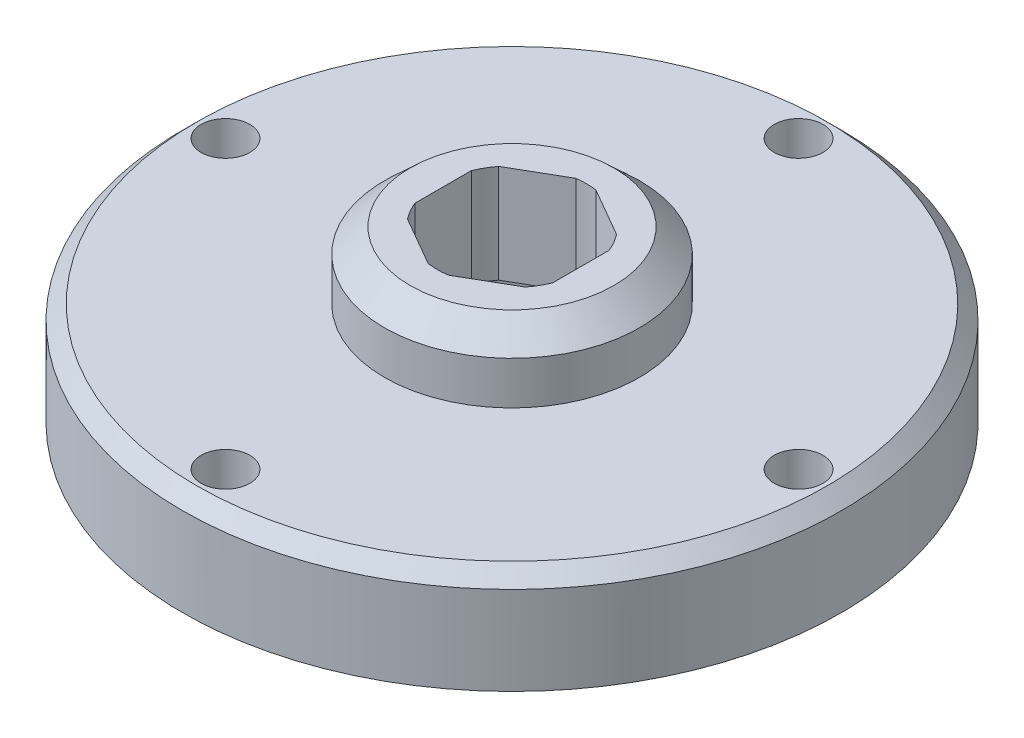
ISO-10303-21;
HEADER;
FILE_DESCRIPTION(('STEP AP214'),'2;1');
FILE_NAME('part.step','',(''),(''),'','','');
FILE_SCHEMA(('AUTOMOTIVE_DESIGN { 1 0 10303 214 1 1 1 1 }'));
ENDSEC;
DATA;
#1=APPLICATION_CONTEXT('core data for automotive mechanical design processes');
#2=APPLICATION_PROTOCOL_DEFINITION('international standard','automotive_design',2000,#1);
#3=PRODUCT_CONTEXT('',#1,'mechanical');
#4=PRODUCT('Part','Part','',(#3));
#5=PRODUCT_RELATED_PRODUCT_CATEGORY('part','',(#4));
#6=PRODUCT_DEFINITION_FORMATION('','',#4);
#7=PRODUCT_DEFINITION_CONTEXT('part definition',#1,'design');
#8=PRODUCT_DEFINITION('design','',#6,#7);
#9=PRODUCT_DEFINITION_SHAPE('','',#8);
#10=(LENGTH_UNIT() NAMED_UNIT(*) SI_UNIT(.MILLI.,.METRE.));
#11=(NAMED_UNIT(*) PLANE_ANGLE_UNIT() SI_UNIT($,.RADIAN.));
#12=(NAMED_UNIT(*) SI_UNIT($,.STERADIAN.) SOLID_ANGLE_UNIT());
#13=UNCERTAINTY_MEASURE_WITH_UNIT(LENGTH_MEASURE(1.E-05),#10,'distance_accuracy_value','');
#14=(GEOMETRIC_REPRESENTATION_CONTEXT(3) GLOBAL_UNCERTAINTY_ASSIGNED_CONTEXT((#13)) GLOBAL_UNIT_ASSIGNED_CONTEXT((#10,
#11,#12)) REPRESENTATION_CONTEXT('',''));
#15=CARTESIAN_POINT('',(0.,0.,0.));
#16=DIRECTION('',(0.,0.,1.));
#17=DIRECTION('',(1.,0.,0.));
#18=AXIS2_PLACEMENT_3D('',#15,#16,#17);
#19=CARTESIAN_POINT('',(0.,0.,0.));
#20=DIRECTION('',(0.,-1.,0.));
#21=DIRECTION('',(0.,0.,-1.));
#22=AXIS2_PLACEMENT_3D('',#19,#20,#21);
#23=CYLINDRICAL_SURFACE('',#22,5.2);
#24=CARTESIAN_POINT('',(0.,11.829,0.));
#25=DIRECTION('',(0.,-1.,0.));
#26=DIRECTION('',(0.,0.,-1.));
#27=AXIS2_PLACEMENT_3D('',#24,#25,#26);
#28=CIRCLE('',#27,5.2);
#29=CARTESIAN_POINT('',(0.700412137687176,11.829,5.15261320471278));
#30=VERTEX_POINT('',#29);
#31=CARTESIAN_POINT('',(-0.700412137687167,11.829,5.15261320471278));
#32=VERTEX_POINT('',#31);
#33=EDGE_CURVE('E151',#30,#32,#28,.T.);
#34=ORIENTED_EDGE('',*,*,#33,.F.);
#35=DIRECTION('',(0.,-1.,0.));
#36=VECTOR('',#35,1.);
#37=CARTESIAN_POINT('',(0.700412137687176,15.7874758746265,5.15261320471278));
#38=LINE('',#37,#36);
#39=CARTESIAN_POINT('',(0.700412137687176,4.953,5.15261320471278));
#40=VERTEX_POINT('',#39);
#41=EDGE_CURVE('E138',#30,#40,#38,.T.);
#42=ORIENTED_EDGE('',*,*,#41,.T.);
#43=CARTESIAN_POINT('',(0.,4.953,0.));
#44=DIRECTION('',(0.,-1.,0.));
#45=DIRECTION('',(0.,0.,-1.));
#46=AXIS2_PLACEMENT_3D('',#43,#44,#45);
#47=CIRCLE('',#46,5.2);
#48=CARTESIAN_POINT('',(-0.700412137687167,4.953,5.15261320471278));
#49=VERTEX_POINT('',#48);
#50=EDGE_CURVE('E149',#40,#49,#47,.T.);
#51=ORIENTED_EDGE('',*,*,#50,.T.);
#52=DIRECTION('',(0.,-1.,0.));
#53=VECTOR('',#52,1.);
#54=CARTESIAN_POINT('',(-0.700412137687167,15.7874758746265,5.15261320471278));
#55=LINE('',#54,#53);
#56=EDGE_CURVE('E228',#32,#49,#55,.T.);
#57=ORIENTED_EDGE('',*,*,#56,.F.);
#58=EDGE_LOOP('',(#34,#42,#51,#57));
#59=FACE_BOUND('',#58,.T.);
#60=ADVANCED_FACE('F47',(#59),#23,.F.);
#61=CARTESIAN_POINT('',(4.8125,4.953,1.96973189800033));
#62=VERTEX_POINT('',#61);
#63=CARTESIAN_POINT('',(4.11208786231283,4.953,3.18288130671244));
#64=VERTEX_POINT('',#63);
#65=EDGE_CURVE('E157',#62,#64,#47,.T.);
#66=ORIENTED_EDGE('',*,*,#65,.T.);
#67=DIRECTION('',(0.,-1.,0.));
#68=VECTOR('',#67,1.);
#69=CARTESIAN_POINT('',(4.11208786231283,15.7874758746265,3.18288130671244));
#70=LINE('',#69,#68);
#71=CARTESIAN_POINT('',(4.11208786231283,11.829,3.18288130671244));
#72=VERTEX_POINT('',#71);
#73=EDGE_CURVE('E141',#72,#64,#70,.T.);
#74=ORIENTED_EDGE('',*,*,#73,.F.);
#75=CARTESIAN_POINT('',(4.8125,11.829,1.96973189800033));
#76=VERTEX_POINT('',#75);
#77=EDGE_CURVE('E268',#76,#72,#28,.T.);
#78=ORIENTED_EDGE('',*,*,#77,.F.);
#79=DIRECTION('',(0.,-1.,0.));
#80=VECTOR('',#79,1.);
#81=CARTESIAN_POINT('',(4.8125,15.7874758746265,1.96973189800033));
#82=LINE('',#81,#80);
#83=EDGE_CURVE('E201',#76,#62,#82,.T.);
#84=ORIENTED_EDGE('',*,*,#83,.T.);
#85=EDGE_LOOP('',(#66,#74,#78,#84));
#86=FACE_BOUND('',#85,.T.);
#87=ADVANCED_FACE('F306',(#86),#23,.F.);
#88=CARTESIAN_POINT('',(4.11208786231283,4.953,-3.18288130671244));
#89=VERTEX_POINT('',#88);
#90=CARTESIAN_POINT('',(4.8125,4.953,-1.96973189800033));
#91=VERTEX_POINT('',#90);
#92=EDGE_CURVE('E161',#89,#91,#47,.T.);
#93=ORIENTED_EDGE('',*,*,#92,.T.);
#94=DIRECTION('',(0.,-1.,0.));
#95=VECTOR('',#94,1.);
#96=CARTESIAN_POINT('',(4.8125,15.7874758746265,-1.96973189800033));
#97=LINE('',#96,#95);
#98=CARTESIAN_POINT('',(4.8125,11.829,-1.96973189800033));
#99=VERTEX_POINT('',#98);
#100=EDGE_CURVE('E192',#99,#91,#97,.T.);
#101=ORIENTED_EDGE('',*,*,#100,.F.);
#102=CARTESIAN_POINT('',(4.11208786231283,11.829,-3.18288130671244));
#103=VERTEX_POINT('',#102);
#104=EDGE_CURVE('E270',#103,#99,#28,.T.);
#105=ORIENTED_EDGE('',*,*,#104,.F.);
#106=DIRECTION('',(0.,-1.,0.));
#107=VECTOR('',#106,1.);
#108=CARTESIAN_POINT('',(4.11208786231283,15.7874758746265,-3.18288130671244));
#109=LINE('',#108,#107);
#110=EDGE_CURVE('E194',#103,#89,#109,.T.);
#111=ORIENTED_EDGE('',*,*,#110,.T.);
#112=EDGE_LOOP('',(#93,#101,#105,#111));
#113=FACE_BOUND('',#112,.T.);
#114=ADVANCED_FACE('F190',(#113),#23,.F.);
#115=CARTESIAN_POINT('',(-0.700412137687172,4.953,-5.15261320471278));
#116=VERTEX_POINT('',#115);
#117=CARTESIAN_POINT('',(0.700412137687175,4.953,-5.15261320471278));
#118=VERTEX_POINT('',#117);
#119=EDGE_CURVE('E175',#116,#118,#47,.T.);
#120=ORIENTED_EDGE('',*,*,#119,.T.);
#121=DIRECTION('',(0.,-1.,0.));
#122=VECTOR('',#121,1.);
#123=CARTESIAN_POINT('',(0.700412137687175,15.7874758746265,-5.15261320471278));
#124=LINE('',#123,#122);
#125=CARTESIAN_POINT('',(0.700412137687175,11.829,-5.15261320471278));
#126=VERTEX_POINT('',#125);
#127=EDGE_CURVE('E207',#126,#118,#124,.T.);
#128=ORIENTED_EDGE('',*,*,#127,.F.);
#129=CARTESIAN_POINT('',(-0.700412137687172,11.829,-5.15261320471278));
#130=VERTEX_POINT('',#129);
#131=EDGE_CURVE('E272',#130,#126,#28,.T.);
#132=ORIENTED_EDGE('',*,*,#131,.F.);
#133=DIRECTION('',(0.,-1.,0.));
#134=VECTOR('',#133,1.);
#135=CARTESIAN_POINT('',(-0.700412137687172,15.7874758746265,-5.15261320471278));
#136=LINE('',#135,#134);
#137=EDGE_CURVE('E217',#130,#116,#136,.T.);
#138=ORIENTED_EDGE('',*,*,#137,.T.);
#139=EDGE_LOOP('',(#120,#128,#132,#138));
#140=FACE_BOUND('',#139,.T.);
#141=ADVANCED_FACE('F324',(#140),#23,.F.);
#142=CARTESIAN_POINT('',(-4.8125,4.953,-1.96973189800034));
#143=VERTEX_POINT('',#142);
#144=CARTESIAN_POINT('',(-4.11208786231283,4.953,-3.18288130671244));
#145=VERTEX_POINT('',#144);
#146=EDGE_CURVE('E168',#143,#145,#47,.T.);
#147=ORIENTED_EDGE('',*,*,#146,.T.);
#148=DIRECTION('',(0.,-1.,0.));
#149=VECTOR('',#148,1.);
#150=CARTESIAN_POINT('',(-4.11208786231283,15.7874758746265,-3.18288130671244));
#151=LINE('',#150,#149);
#152=CARTESIAN_POINT('',(-4.11208786231283,11.829,-3.18288130671244));
#153=VERTEX_POINT('',#152);
#154=EDGE_CURVE('E212',#153,#145,#151,.T.);
#155=ORIENTED_EDGE('',*,*,#154,.F.);
#156=CARTESIAN_POINT('',(-4.8125,11.829,-1.96973189800034));
#157=VERTEX_POINT('',#156);
#158=EDGE_CURVE('E163',#157,#153,#28,.T.);
#159=ORIENTED_EDGE('',*,*,#158,.F.);
#160=DIRECTION('',(0.,-1.,0.));
#161=VECTOR('',#160,1.);
#162=CARTESIAN_POINT('',(-4.8125,15.7874758746265,-1.96973189800034));
#163=LINE('',#162,#161);
#164=EDGE_CURVE('E225',#157,#143,#163,.T.);
#165=ORIENTED_EDGE('',*,*,#164,.T.);
#166=EDGE_LOOP('',(#147,#155,#159,#165));
#167=FACE_BOUND('',#166,.T.);
#168=ADVANCED_FACE('F281',(#167),#23,.F.);
#169=CARTESIAN_POINT('',(-4.11208786231283,4.953,3.18288130671244));
#170=VERTEX_POINT('',#169);
#171=CARTESIAN_POINT('',(-4.8125,4.953,1.96973189800034));
#172=VERTEX_POINT('',#171);
#173=EDGE_CURVE('E160',#170,#172,#47,.T.);
#174=ORIENTED_EDGE('',*,*,#173,.T.);
#175=DIRECTION('',(0.,-1.,0.));
#176=VECTOR('',#175,1.);
#177=CARTESIAN_POINT('',(-4.8125,15.7874758746265,1.96973189800034));
#178=LINE('',#177,#176);
#179=CARTESIAN_POINT('',(-4.8125,11.829,1.96973189800034));
#180=VERTEX_POINT('',#179);
#181=EDGE_CURVE('E220',#180,#172,#178,.T.);
#182=ORIENTED_EDGE('',*,*,#181,.F.);
#183=CARTESIAN_POINT('',(-4.11208786231283,11.829,3.18288130671244));
#184=VERTEX_POINT('',#183);
#185=EDGE_CURVE('E158',#184,#180,#28,.T.);
#186=ORIENTED_EDGE('',*,*,#185,.F.);
#187=DIRECTION('',(0.,-1.,0.));
#188=VECTOR('',#187,1.);
#189=CARTESIAN_POINT('',(-4.11208786231283,15.7874758746265,3.18288130671244));
#190=LINE('',#189,#188);
#191=EDGE_CURVE('E232',#184,#170,#190,.T.);
#192=ORIENTED_EDGE('',*,*,#191,.T.);
#193=EDGE_LOOP('',(#174,#182,#186,#192));
#194=FACE_BOUND('',#193,.T.);
#195=ADVANCED_FACE('F289',(#194),#23,.F.);
#196=CARTESIAN_POINT('',(23.,0.,0.));
#197=DIRECTION('',(0.,-1.,0.));
#198=DIRECTION('',(0.,0.,-1.));
#199=AXIS2_PLACEMENT_3D('',#196,#197,#198);
#200=PLANE('',#199);
#201=CARTESIAN_POINT('',(0.,0.,0.));
#202=DIRECTION('',(0.,-1.,0.));
#203=DIRECTION('',(0.,0.,-1.));
#204=AXIS2_PLACEMENT_3D('',#201,#202,#203);
#205=CIRCLE('',#204,7.55);
#206=CARTESIAN_POINT('',(0.,0.,-7.55));
#207=VERTEX_POINT('',#206);
#208=EDGE_CURVE('E543',#207,#207,#205,.F.);
#209=ORIENTED_EDGE('',*,*,#208,.T.);
#210=EDGE_LOOP('',(#209));
#211=FACE_BOUND('',#210,.T.);
#212=CARTESIAN_POINT('',(-2.09488880330588E-13,0.,20.));
#213=DIRECTION('',(0.,-1.,0.));
#214=DIRECTION('',(0.,0.,-1.));
#215=AXIS2_PLACEMENT_3D('',#212,#213,#214);
#216=CIRCLE('',#215,1.69999999999999);
#217=CARTESIAN_POINT('',(-2.09488880330588E-13,0.,18.3));
#218=VERTEX_POINT('',#217);
#219=EDGE_CURVE('E235',#218,#218,#216,.T.);
#220=ORIENTED_EDGE('',*,*,#219,.F.);
#221=EDGE_LOOP('',(#220));
#222=FACE_BOUND('',#221,.T.);
#223=CARTESIAN_POINT('',(20.,0.,0.));
#224=DIRECTION('',(0.,-1.,0.));
#225=DIRECTION('',(0.,0.,-1.));
#226=AXIS2_PLACEMENT_3D('',#223,#224,#225);
#227=CIRCLE('',#226,1.69999999999999);
#228=CARTESIAN_POINT('',(20.,0.,-1.69999999999999));
#229=VERTEX_POINT('',#228);
#230=EDGE_CURVE('E241',#229,#229,#227,.T.);
#231=ORIENTED_EDGE('',*,*,#230,.F.);
#232=EDGE_LOOP('',(#231));
#233=FACE_BOUND('',#232,.T.);
#234=CARTESIAN_POINT('',(0.,0.,-20.));
#235=DIRECTION('',(0.,-1.,0.));
#236=DIRECTION('',(0.,0.,-1.));
#237=AXIS2_PLACEMENT_3D('',#234,#235,#236);
#238=CIRCLE('',#237,1.69999999999999);
#239=CARTESIAN_POINT('',(0.,0.,-21.7));
#240=VERTEX_POINT('',#239);
#241=EDGE_CURVE('E247',#240,#240,#238,.T.);
#242=ORIENTED_EDGE('',*,*,#241,.F.);
#243=EDGE_LOOP('',(#242));
#244=FACE_BOUND('',#243,.T.);
#245=CARTESIAN_POINT('',(-20.,0.,0.));
#246=DIRECTION('',(0.,-1.,0.));
#247=DIRECTION('',(0.,0.,-1.));
#248=AXIS2_PLACEMENT_3D('',#245,#246,#247);
#249=CIRCLE('',#248,1.69999999999999);
#250=CARTESIAN_POINT('',(-20.,0.,-1.69999999999999));
#251=VERTEX_POINT('',#250);
#252=EDGE_CURVE('E251',#251,#251,#249,.T.);
#253=ORIENTED_EDGE('',*,*,#252,.F.);
#254=EDGE_LOOP('',(#253));
#255=FACE_BOUND('',#254,.T.);
#256=CARTESIAN_POINT('',(0.,0.,0.));
#257=DIRECTION('',(0.,-1.,0.));
#258=DIRECTION('',(0.,0.,-1.));
#259=AXIS2_PLACEMENT_3D('',#256,#257,#258);
#260=CIRCLE('',#259,23.);
#261=CARTESIAN_POINT('',(0.,0.,-23.));
#262=VERTEX_POINT('',#261);
#263=EDGE_CURVE('E255',#262,#262,#260,.T.);
#264=ORIENTED_EDGE('',*,*,#263,.T.);
#265=EDGE_LOOP('',(#264));
#266=FACE_BOUND('',#265,.T.);
#267=ADVANCED_FACE('F315',(#211,#222,#233,#244,#255,#266),#200,.T.);
#268=CARTESIAN_POINT('',(0.,0.,0.));
#269=DIRECTION('',(0.,-1.,0.));
#270=DIRECTION('',(0.,0.,-1.));
#271=AXIS2_PLACEMENT_3D('',#268,#269,#270);
#272=CYLINDRICAL_SURFACE('',#271,6.8);
#273=CARTESIAN_POINT('',(0.,0.749999999999996,0.));
#274=DIRECTION('',(0.,-1.,0.));
#275=DIRECTION('',(0.,0.,-1.));
#276=AXIS2_PLACEMENT_3D('',#273,#274,#275);
#277=CIRCLE('',#276,6.8);
#278=CARTESIAN_POINT('',(0.,0.749999999999996,-6.8));
#279=VERTEX_POINT('',#278);
#280=EDGE_CURVE('E173',#279,#279,#277,.T.);
#281=ORIENTED_EDGE('',*,*,#280,.T.);
#282=EDGE_LOOP('',(#281));
#283=FACE_BOUND('',#282,.T.);
#284=CARTESIAN_POINT('',(0.,4.953,0.));
#285=DIRECTION('',(0.,-1.,0.));
#286=DIRECTION('',(0.,0.,-1.));
#287=AXIS2_PLACEMENT_3D('',#284,#285,#286);
#288=CIRCLE('',#287,6.8);
#289=CARTESIAN_POINT('',(0.,4.953,-6.8));
#290=VERTEX_POINT('',#289);
#291=EDGE_CURVE('E167',#290,#290,#288,.T.);
#292=ORIENTED_EDGE('',*,*,#291,.F.);
#293=EDGE_LOOP('',(#292));
#294=FACE_BOUND('',#293,.T.);
#295=ADVANCED_FACE('F321',(#283,#294),#272,.F.);
#296=CARTESIAN_POINT('',(6.8,4.953,0.));
#297=DIRECTION('',(0.,-1.,0.));
#298=DIRECTION('',(0.,0.,-1.));
#299=AXIS2_PLACEMENT_3D('',#296,#297,#298);
#300=PLANE('',#299);
#301=ORIENTED_EDGE('',*,*,#291,.T.);
#302=EDGE_LOOP('',(#301));
#303=FACE_BOUND('',#302,.T.);
#304=ORIENTED_EDGE('',*,*,#173,.F.);
#305=DIRECTION('',(-0.866025403784438,0.,-0.5));
#306=VECTOR('',#305,1.);
#307=CARTESIAN_POINT('',(-2.40625,4.953,4.16774725571261));
#308=LINE('',#307,#306);
#309=EDGE_CURVE('E156',#49,#170,#308,.T.);
#310=ORIENTED_EDGE('',*,*,#309,.F.);
#311=ORIENTED_EDGE('',*,*,#50,.F.);
#312=DIRECTION('',(-0.866025403784438,0.,0.5));
#313=VECTOR('',#312,1.);
#314=CARTESIAN_POINT('',(2.40625,4.953,4.16774725571261));
#315=LINE('',#314,#313);
#316=EDGE_CURVE('E135',#64,#40,#315,.T.);
#317=ORIENTED_EDGE('',*,*,#316,.F.);
#318=ORIENTED_EDGE('',*,*,#65,.F.);
#319=DIRECTION('',(0.,0.,1.));
#320=VECTOR('',#319,1.);
#321=CARTESIAN_POINT('',(4.8125,4.953,0.));
#322=LINE('',#321,#320);
#323=EDGE_CURVE('E198',#91,#62,#322,.T.);
#324=ORIENTED_EDGE('',*,*,#323,.F.);
#325=ORIENTED_EDGE('',*,*,#92,.F.);
#326=DIRECTION('',(0.866025403784439,0.,0.5));
#327=VECTOR('',#326,1.);
#328=CARTESIAN_POINT('',(2.40625,4.953,-4.16774725571261));
#329=LINE('',#328,#327);
#330=EDGE_CURVE('E197',#118,#89,#329,.T.);
#331=ORIENTED_EDGE('',*,*,#330,.F.);
#332=ORIENTED_EDGE('',*,*,#119,.F.);
#333=DIRECTION('',(0.866025403784439,0.,-0.5));
#334=VECTOR('',#333,1.);
#335=CARTESIAN_POINT('',(-2.40625,4.953,-4.16774725571261));
#336=LINE('',#335,#334);
#337=EDGE_CURVE('E215',#145,#116,#336,.T.);
#338=ORIENTED_EDGE('',*,*,#337,.F.);
#339=ORIENTED_EDGE('',*,*,#146,.F.);
#340=DIRECTION('',(0.,0.,-1.));
#341=VECTOR('',#340,1.);
#342=CARTESIAN_POINT('',(-4.8125,4.953,0.));
#343=LINE('',#342,#341);
#344=EDGE_CURVE('E223',#172,#143,#343,.T.);
#345=ORIENTED_EDGE('',*,*,#344,.F.);
#346=EDGE_LOOP('',(#304,#310,#311,#317,#318,#324,#325,#331,#332,#338,#339,#345));
#347=FACE_BOUND('',#346,.T.);
#348=ADVANCED_FACE('F155',(#303,#347),#300,.T.);
#349=CARTESIAN_POINT('',(5.2,11.829,0.));
#350=DIRECTION('',(0.,1.,0.));
#351=DIRECTION('',(0.,0.,1.));
#352=AXIS2_PLACEMENT_3D('',#349,#350,#351);
#353=PLANE('',#352);
#354=ORIENTED_EDGE('',*,*,#185,.T.);
#355=DIRECTION('',(0.,0.,-1.));
#356=VECTOR('',#355,1.);
#357=CARTESIAN_POINT('',(-4.8125,11.829,0.));
#358=LINE('',#357,#356);
#359=EDGE_CURVE('E226',#180,#157,#358,.T.);
#360=ORIENTED_EDGE('',*,*,#359,.T.);
#361=ORIENTED_EDGE('',*,*,#158,.T.);
#362=DIRECTION('',(0.866025403784439,0.,-0.5));
#363=VECTOR('',#362,1.);
#364=CARTESIAN_POINT('',(-2.40625,11.829,-4.16774725571261));
#365=LINE('',#364,#363);
#366=EDGE_CURVE('E218',#153,#130,#365,.T.);
#367=ORIENTED_EDGE('',*,*,#366,.T.);
#368=ORIENTED_EDGE('',*,*,#131,.T.);
#369=DIRECTION('',(0.866025403784439,0.,0.5));
#370=VECTOR('',#369,1.);
#371=CARTESIAN_POINT('',(2.40625,11.829,-4.16774725571261));
#372=LINE('',#371,#370);
#373=EDGE_CURVE('E210',#126,#103,#372,.T.);
#374=ORIENTED_EDGE('',*,*,#373,.T.);
#375=ORIENTED_EDGE('',*,*,#104,.T.);
#376=DIRECTION('',(0.,0.,1.));
#377=VECTOR('',#376,1.);
#378=CARTESIAN_POINT('',(4.8125,11.829,0.));
#379=LINE('',#378,#377);
#380=EDGE_CURVE('E69',#99,#76,#379,.T.);
#381=ORIENTED_EDGE('',*,*,#380,.T.);
#382=ORIENTED_EDGE('',*,*,#77,.T.);
#383=DIRECTION('',(-0.866025403784439,0.,0.5));
#384=VECTOR('',#383,1.);
#385=CARTESIAN_POINT('',(2.40625,11.829,4.16774725571261));
#386=LINE('',#385,#384);
#387=EDGE_CURVE('E63',#72,#30,#386,.T.);
#388=ORIENTED_EDGE('',*,*,#387,.T.);
#389=ORIENTED_EDGE('',*,*,#33,.T.);
#390=DIRECTION('',(-0.866025403784439,0.,-0.5));
#391=VECTOR('',#390,1.);
#392=CARTESIAN_POINT('',(-2.40625,11.829,4.16774725571261));
#393=LINE('',#392,#391);
#394=EDGE_CURVE('E233',#32,#184,#393,.T.);
#395=ORIENTED_EDGE('',*,*,#394,.T.);
#396=EDGE_LOOP('',(#354,#360,#361,#367,#368,#374,#375,#381,#382,#388,#389,#395));
#397=FACE_BOUND('',#396,.T.);
#398=CARTESIAN_POINT('',(0.,11.829,0.));
#399=DIRECTION('',(0.,-1.,0.));
#400=DIRECTION('',(0.,0.,-1.));
#401=AXIS2_PLACEMENT_3D('',#398,#399,#400);
#402=CIRCLE('',#401,7.112);
#403=CARTESIAN_POINT('',(0.,11.829,-7.112));
#404=VERTEX_POINT('',#403);
#405=EDGE_CURVE('E264',#404,#404,#402,.T.);
#406=ORIENTED_EDGE('',*,*,#405,.F.);
#407=EDGE_LOOP('',(#406));
#408=FACE_BOUND('',#407,.T.);
#409=ADVANCED_FACE('F277',(#397,#408),#353,.T.);
#410=CARTESIAN_POINT('',(0.,10.1665,0.));
#411=DIRECTION('',(0.,-1.,0.));
#412=DIRECTION('',(0.,0.,-1.));
#413=AXIS2_PLACEMENT_3D('',#410,#411,#412);
#414=CONICAL_SURFACE('',#413,8.9,0.821753677969278);
#415=ORIENTED_EDGE('',*,*,#405,.T.);
#416=EDGE_LOOP('',(#415));
#417=FACE_BOUND('',#416,.T.);
#418=CARTESIAN_POINT('',(0.,10.1665,0.));
#419=DIRECTION('',(0.,-1.,0.));
#420=DIRECTION('',(0.,0.,-1.));
#421=AXIS2_PLACEMENT_3D('',#418,#419,#420);
#422=CIRCLE('',#421,8.9);
#423=CARTESIAN_POINT('',(0.,10.1665,-8.9));
#424=VERTEX_POINT('',#423);
#425=EDGE_CURVE('E261',#424,#424,#422,.T.);
#426=ORIENTED_EDGE('',*,*,#425,.F.);
#427=EDGE_LOOP('',(#426));
#428=FACE_BOUND('',#427,.T.);
#429=ADVANCED_FACE('F379',(#417,#428),#414,.T.);
#430=CARTESIAN_POINT('',(0.,0.,0.));
#431=DIRECTION('',(0.,-1.,0.));
#432=DIRECTION('',(0.,0.,-1.));
#433=AXIS2_PLACEMENT_3D('',#430,#431,#432);
#434=CYLINDRICAL_SURFACE('',#433,8.9);
#435=ORIENTED_EDGE('',*,*,#425,.T.);
#436=EDGE_LOOP('',(#435));
#437=FACE_BOUND('',#436,.T.);
#438=CARTESIAN_POINT('',(0.,7.1665,0.));
#439=DIRECTION('',(0.,-1.,0.));
#440=DIRECTION('',(0.,0.,-1.));
#441=AXIS2_PLACEMENT_3D('',#438,#439,#440);
#442=CIRCLE('',#441,8.9);
#443=CARTESIAN_POINT('',(0.,7.1665,-8.9));
#444=VERTEX_POINT('',#443);
#445=EDGE_CURVE('E258',#444,#444,#442,.T.);
#446=ORIENTED_EDGE('',*,*,#445,.F.);
#447=EDGE_LOOP('',(#446));
#448=FACE_BOUND('',#447,.T.);
#449=ADVANCED_FACE('F494',(#437,#448),#434,.T.);
#450=CARTESIAN_POINT('',(8.9,7.1665,0.));
#451=DIRECTION('',(0.,1.,0.));
#452=DIRECTION('',(0.,0.,1.));
#453=AXIS2_PLACEMENT_3D('',#450,#451,#452);
#454=PLANE('',#453);
#455=CARTESIAN_POINT('',(0.,7.1665,0.));
#456=DIRECTION('',(0.,1.,0.));
#457=DIRECTION('',(0.,0.,1.));
#458=AXIS2_PLACEMENT_3D('',#455,#456,#457);
#459=CIRCLE('',#458,22.);
#460=CARTESIAN_POINT('',(0.,7.1665,22.));
#461=VERTEX_POINT('',#460);
#462=EDGE_CURVE('E11',#461,#461,#459,.T.);
#463=ORIENTED_EDGE('',*,*,#462,.T.);
#464=EDGE_LOOP('',(#463));
#465=FACE_BOUND('',#464,.T.);
#466=CARTESIAN_POINT('',(-2.09488880330588E-13,7.1665,20.));
#467=DIRECTION('',(0.,1.,0.));
#468=DIRECTION('',(0.,0.,1.));
#469=AXIS2_PLACEMENT_3D('',#466,#467,#468);
#470=CIRCLE('',#469,1.69999999999999);
#471=CARTESIAN_POINT('',(-2.09488880330588E-13,7.1665,21.7));
#472=VERTEX_POINT('',#471);
#473=EDGE_CURVE('E240',#472,#472,#470,.T.);
#474=ORIENTED_EDGE('',*,*,#473,.F.);
#475=EDGE_LOOP('',(#474));
#476=FACE_BOUND('',#475,.T.);
#477=CARTESIAN_POINT('',(20.,7.1665,0.));
#478=DIRECTION('',(0.,1.,0.));
#479=DIRECTION('',(0.,0.,1.));
#480=AXIS2_PLACEMENT_3D('',#477,#478,#479);
#481=CIRCLE('',#480,1.69999999999999);
#482=CARTESIAN_POINT('',(20.,7.1665,1.69999999999999));
#483=VERTEX_POINT('',#482);
#484=EDGE_CURVE('E244',#483,#483,#481,.T.);
#485=ORIENTED_EDGE('',*,*,#484,.F.);
#486=EDGE_LOOP('',(#485));
#487=FACE_BOUND('',#486,.T.);
#488=CARTESIAN_POINT('',(0.,7.1665,-20.));
#489=DIRECTION('',(0.,1.,0.));
#490=DIRECTION('',(0.,0.,1.));
#491=AXIS2_PLACEMENT_3D('',#488,#489,#490);
#492=CIRCLE('',#491,1.69999999999999);
#493=CARTESIAN_POINT('',(0.,7.1665,-18.3));
#494=VERTEX_POINT('',#493);
#495=EDGE_CURVE('E250',#494,#494,#492,.T.);
#496=ORIENTED_EDGE('',*,*,#495,.F.);
#497=EDGE_LOOP('',(#496));
#498=FACE_BOUND('',#497,.T.);
#499=CARTESIAN_POINT('',(-20.,7.1665,0.));
#500=DIRECTION('',(0.,1.,0.));
#501=DIRECTION('',(0.,0.,1.));
#502=AXIS2_PLACEMENT_3D('',#499,#500,#501);
#503=CIRCLE('',#502,1.69999999999999);
#504=CARTESIAN_POINT('',(-20.,7.1665,1.69999999999999));
#505=VERTEX_POINT('',#504);
#506=EDGE_CURVE('E254',#505,#505,#503,.T.);
#507=ORIENTED_EDGE('',*,*,#506,.F.);
#508=EDGE_LOOP('',(#507));
#509=FACE_BOUND('',#508,.T.);
#510=ORIENTED_EDGE('',*,*,#445,.T.);
#511=EDGE_LOOP('',(#510));
#512=FACE_BOUND('',#511,.T.);
#513=ADVANCED_FACE('F485',(#465,#476,#487,#498,#509,#512),#454,.T.);
#514=CARTESIAN_POINT('',(0.,0.,0.));
#515=DIRECTION('',(0.,-1.,0.));
#516=DIRECTION('',(0.,0.,-1.));
#517=AXIS2_PLACEMENT_3D('',#514,#515,#516);
#518=CYLINDRICAL_SURFACE('',#517,23.);
#519=CARTESIAN_POINT('',(0.,6.1665,0.));
#520=DIRECTION('',(0.,1.,0.));
#521=DIRECTION('',(0.,0.,1.));
#522=AXIS2_PLACEMENT_3D('',#519,#520,#521);
#523=CIRCLE('',#522,23.);
#524=CARTESIAN_POINT('',(0.,6.1665,23.));
#525=VERTEX_POINT('',#524);
#526=EDGE_CURVE('E56',#525,#525,#523,.F.);
#527=ORIENTED_EDGE('',*,*,#526,.T.);
#528=EDGE_LOOP('',(#527));
#529=FACE_BOUND('',#528,.T.);
#530=ORIENTED_EDGE('',*,*,#263,.F.);
#531=EDGE_LOOP('',(#530));
#532=FACE_BOUND('',#531,.T.);
#533=ADVANCED_FACE('F481',(#529,#532),#518,.T.);
#534=CARTESIAN_POINT('',(-20.,0.,0.));
#535=DIRECTION('',(0.,-1.,0.));
#536=DIRECTION('',(0.,0.,-1.));
#537=AXIS2_PLACEMENT_3D('',#534,#535,#536);
#538=CYLINDRICAL_SURFACE('',#537,1.69999999999999);
#539=ORIENTED_EDGE('',*,*,#506,.T.);
#540=EDGE_LOOP('',(#539));
#541=FACE_BOUND('',#540,.T.);
#542=ORIENTED_EDGE('',*,*,#252,.T.);
#543=EDGE_LOOP('',(#542));
#544=FACE_BOUND('',#543,.T.);
#545=ADVANCED_FACE('F484',(#541,#544),#538,.F.);
#546=CARTESIAN_POINT('',(0.,0.,-20.));
#547=DIRECTION('',(0.,-1.,0.));
#548=DIRECTION('',(0.,0.,-1.));
#549=AXIS2_PLACEMENT_3D('',#546,#547,#548);
#550=CYLINDRICAL_SURFACE('',#549,1.69999999999999);
#551=ORIENTED_EDGE('',*,*,#495,.T.);
#552=EDGE_LOOP('',(#551));
#553=FACE_BOUND('',#552,.T.);
#554=ORIENTED_EDGE('',*,*,#241,.T.);
#555=EDGE_LOOP('',(#554));
#556=FACE_BOUND('',#555,.T.);
#557=ADVANCED_FACE('F566',(#553,#556),#550,.F.);
#558=CARTESIAN_POINT('',(20.,0.,0.));
#559=DIRECTION('',(0.,-1.,0.));
#560=DIRECTION('',(0.,0.,-1.));
#561=AXIS2_PLACEMENT_3D('',#558,#559,#560);
#562=CYLINDRICAL_SURFACE('',#561,1.69999999999999);
#563=ORIENTED_EDGE('',*,*,#484,.T.);
#564=EDGE_LOOP('',(#563));
#565=FACE_BOUND('',#564,.T.);
#566=ORIENTED_EDGE('',*,*,#230,.T.);
#567=EDGE_LOOP('',(#566));
#568=FACE_BOUND('',#567,.T.);
#569=ADVANCED_FACE('F302',(#565,#568),#562,.F.);
#570=CARTESIAN_POINT('',(-2.09488880330588E-13,0.,20.));
#571=DIRECTION('',(0.,-1.,0.));
#572=DIRECTION('',(0.,0.,-1.));
#573=AXIS2_PLACEMENT_3D('',#570,#571,#572);
#574=CYLINDRICAL_SURFACE('',#573,1.69999999999999);
#575=ORIENTED_EDGE('',*,*,#473,.T.);
#576=EDGE_LOOP('',(#575));
#577=FACE_BOUND('',#576,.T.);
#578=ORIENTED_EDGE('',*,*,#219,.T.);
#579=EDGE_LOOP('',(#578));
#580=FACE_BOUND('',#579,.T.);
#581=ADVANCED_FACE('F294',(#577,#580),#574,.F.);
#582=CARTESIAN_POINT('',(-2.40625,15.7874758746265,4.16774725571261));
#583=DIRECTION('',(-0.5,0.,0.866025403784439));
#584=DIRECTION('',(0.866025403784439,0.,0.5));
#585=AXIS2_PLACEMENT_3D('',#582,#583,#584);
#586=PLANE('',#585);
#587=ORIENTED_EDGE('',*,*,#394,.F.);
#588=ORIENTED_EDGE('',*,*,#56,.T.);
#589=ORIENTED_EDGE('',*,*,#309,.T.);
#590=ORIENTED_EDGE('',*,*,#191,.F.);
#591=EDGE_LOOP('',(#587,#588,#589,#590));
#592=FACE_BOUND('',#591,.T.);
#593=ADVANCED_FACE('F292',(#592),#586,.F.);
#594=CARTESIAN_POINT('',(-4.8125,15.7874758746265,0.));
#595=DIRECTION('',(-1.,0.,0.));
#596=DIRECTION('',(0.,0.,1.));
#597=AXIS2_PLACEMENT_3D('',#594,#595,#596);
#598=PLANE('',#597);
#599=ORIENTED_EDGE('',*,*,#359,.F.);
#600=ORIENTED_EDGE('',*,*,#181,.T.);
#601=ORIENTED_EDGE('',*,*,#344,.T.);
#602=ORIENTED_EDGE('',*,*,#164,.F.);
#603=EDGE_LOOP('',(#599,#600,#601,#602));
#604=FACE_BOUND('',#603,.T.);
#605=ADVANCED_FACE('F287',(#604),#598,.F.);
#606=CARTESIAN_POINT('',(-2.40625,15.7874758746265,-4.16774725571261));
#607=DIRECTION('',(-0.5,0.,-0.866025403784439));
#608=DIRECTION('',(-0.866025403784439,0.,0.5));
#609=AXIS2_PLACEMENT_3D('',#606,#607,#608);
#610=PLANE('',#609);
#611=ORIENTED_EDGE('',*,*,#366,.F.);
#612=ORIENTED_EDGE('',*,*,#154,.T.);
#613=ORIENTED_EDGE('',*,*,#337,.T.);
#614=ORIENTED_EDGE('',*,*,#137,.F.);
#615=EDGE_LOOP('',(#611,#612,#613,#614));
#616=FACE_BOUND('',#615,.T.);
#617=ADVANCED_FACE('F284',(#616),#610,.F.);
#618=CARTESIAN_POINT('',(2.40625,15.7874758746265,-4.16774725571261));
#619=DIRECTION('',(0.5,0.,-0.866025403784439));
#620=DIRECTION('',(-0.866025403784439,0.,-0.5));
#621=AXIS2_PLACEMENT_3D('',#618,#619,#620);
#622=PLANE('',#621);
#623=ORIENTED_EDGE('',*,*,#373,.F.);
#624=ORIENTED_EDGE('',*,*,#127,.T.);
#625=ORIENTED_EDGE('',*,*,#330,.T.);
#626=ORIENTED_EDGE('',*,*,#110,.F.);
#627=EDGE_LOOP('',(#623,#624,#625,#626));
#628=FACE_BOUND('',#627,.T.);
#629=ADVANCED_FACE('F432',(#628),#622,.F.);
#630=CARTESIAN_POINT('',(4.8125,15.7874758746265,0.));
#631=DIRECTION('',(1.,0.,0.));
#632=DIRECTION('',(0.,0.,-1.));
#633=AXIS2_PLACEMENT_3D('',#630,#631,#632);
#634=PLANE('',#633);
#635=ORIENTED_EDGE('',*,*,#380,.F.);
#636=ORIENTED_EDGE('',*,*,#100,.T.);
#637=ORIENTED_EDGE('',*,*,#323,.T.);
#638=ORIENTED_EDGE('',*,*,#83,.F.);
#639=EDGE_LOOP('',(#635,#636,#637,#638));
#640=FACE_BOUND('',#639,.T.);
#641=ADVANCED_FACE('F441',(#640),#634,.F.);
#642=CARTESIAN_POINT('',(2.40625,15.7874758746265,4.16774725571261));
#643=DIRECTION('',(0.5,0.,0.866025403784439));
#644=DIRECTION('',(0.866025403784439,0.,-0.5));
#645=AXIS2_PLACEMENT_3D('',#642,#643,#644);
#646=PLANE('',#645);
#647=ORIENTED_EDGE('',*,*,#387,.F.);
#648=ORIENTED_EDGE('',*,*,#73,.T.);
#649=ORIENTED_EDGE('',*,*,#316,.T.);
#650=ORIENTED_EDGE('',*,*,#41,.F.);
#651=EDGE_LOOP('',(#647,#648,#649,#650));
#652=FACE_BOUND('',#651,.T.);
#653=ADVANCED_FACE('F137',(#652),#646,.F.);
#654=CARTESIAN_POINT('',(0.,0.749999999999996,0.));
#655=DIRECTION('',(0.,-1.,0.));
#656=DIRECTION('',(0.,0.,-1.));
#657=AXIS2_PLACEMENT_3D('',#654,#655,#656);
#658=CONICAL_SURFACE('',#657,6.8,0.785398163397451);
#659=ORIENTED_EDGE('',*,*,#208,.F.);
#660=EDGE_LOOP('',(#659));
#661=FACE_BOUND('',#660,.T.);
#662=ORIENTED_EDGE('',*,*,#280,.F.);
#663=EDGE_LOOP('',(#662));
#664=FACE_BOUND('',#663,.T.);
#665=ADVANCED_FACE('F459',(#661,#664),#658,.F.);
#666=CARTESIAN_POINT('',(0.,6.1665,0.));
#667=DIRECTION('',(0.,-1.,0.));
#668=DIRECTION('',(0.,0.,-1.));
#669=AXIS2_PLACEMENT_3D('',#666,#667,#668);
#670=CONICAL_SURFACE('',#669,23.,0.785398163397452);
#671=ORIENTED_EDGE('',*,*,#462,.F.);
#672=EDGE_LOOP('',(#671));
#673=FACE_BOUND('',#672,.T.);
#674=ORIENTED_EDGE('',*,*,#526,.F.);
#675=EDGE_LOOP('',(#674));
#676=FACE_BOUND('',#675,.T.);
#677=ADVANCED_FACE('F50',(#673,#676),#670,.T.);
#678=CLOSED_SHELL('',(#60,#87,#114,#141,#168,#195,#267,#295,#348,#409,#429,#449,#513,#533,#545,
#557,#569,#581,#593,#605,#617,#629,#641,#653,#665,#677));
#679=MANIFOLD_SOLID_BREP('B2',#678);
#680=ADVANCED_BREP_SHAPE_REPRESENTATION('',(#18,#679),#14);
#681=SHAPE_DEFINITION_REPRESENTATION(#9,#680);
ENDSEC;
END-ISO-10303-21;
